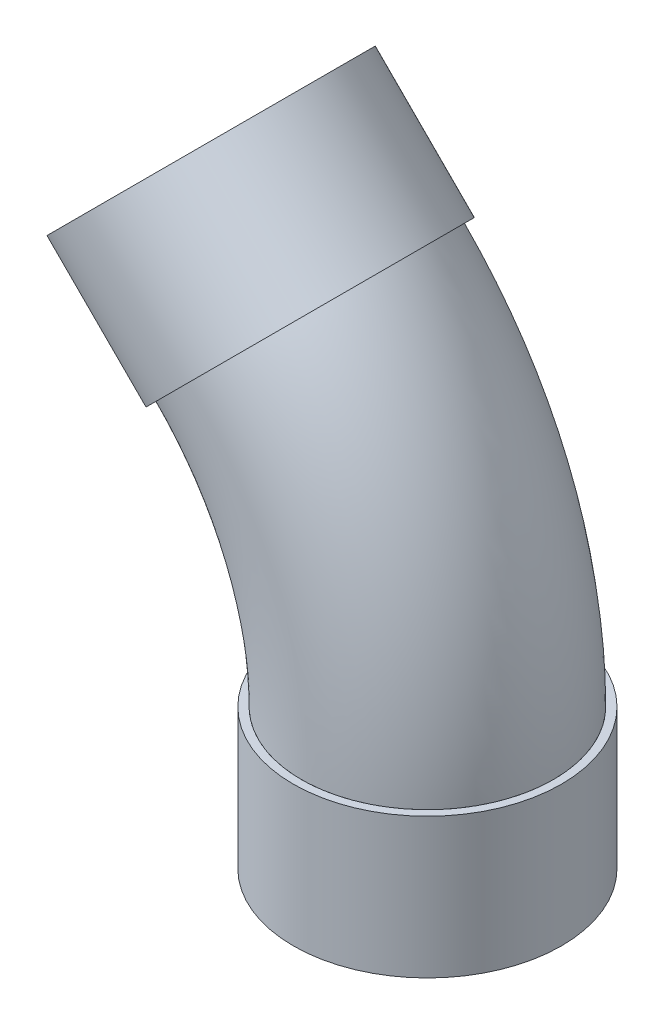
ISO-10303-21;
HEADER;
FILE_DESCRIPTION(('STEP AP214'),'2;1');
FILE_NAME('part.step','',(''),(''),'','','');
FILE_SCHEMA(('AUTOMOTIVE_DESIGN { 1 0 10303 214 1 1 1 1 }'));
ENDSEC;
DATA;
#1=APPLICATION_CONTEXT('core data for automotive mechanical design processes');
#2=APPLICATION_PROTOCOL_DEFINITION('international standard','automotive_design',2000,#1);
#3=PRODUCT_CONTEXT('',#1,'mechanical');
#4=PRODUCT('Part','Part','',(#3));
#5=PRODUCT_RELATED_PRODUCT_CATEGORY('part','',(#4));
#6=PRODUCT_DEFINITION_FORMATION('','',#4);
#7=PRODUCT_DEFINITION_CONTEXT('part definition',#1,'design');
#8=PRODUCT_DEFINITION('design','',#6,#7);
#9=PRODUCT_DEFINITION_SHAPE('','',#8);
#10=(LENGTH_UNIT() NAMED_UNIT(*) SI_UNIT(.MILLI.,.METRE.));
#11=(NAMED_UNIT(*) PLANE_ANGLE_UNIT() SI_UNIT($,.RADIAN.));
#12=(NAMED_UNIT(*) SI_UNIT($,.STERADIAN.) SOLID_ANGLE_UNIT());
#13=UNCERTAINTY_MEASURE_WITH_UNIT(LENGTH_MEASURE(1.E-05),#10,'distance_accuracy_value','');
#14=(GEOMETRIC_REPRESENTATION_CONTEXT(3) GLOBAL_UNCERTAINTY_ASSIGNED_CONTEXT((#13)) GLOBAL_UNIT_ASSIGNED_CONTEXT((#10,
#11,#12)) REPRESENTATION_CONTEXT('',''));
#15=CARTESIAN_POINT('',(0.,0.,0.));
#16=DIRECTION('',(0.,0.,1.));
#17=DIRECTION('',(1.,0.,0.));
#18=AXIS2_PLACEMENT_3D('',#15,#16,#17);
#19=CARTESIAN_POINT('',(-1.70639071493638E-10,1.70639071494461E-10,0.));
#20=DIRECTION('',(-0.707106781184842,0.707106781188253,0.));
#21=DIRECTION('',(-0.707106781188253,-0.707106781184842,0.));
#22=AXIS2_PLACEMENT_3D('',#19,#20,#21);
#23=PLANE('',#22);
#24=CARTESIAN_POINT('',(70.7106781186546,70.7106781186549,0.));
#25=DIRECTION('',(-0.707106781186548,0.707106781186547,0.));
#26=DIRECTION('',(-0.707106781186547,-0.707106781186548,0.));
#27=AXIS2_PLACEMENT_3D('',#24,#25,#26);
#28=CIRCLE('',#27,31.5);
#29=CARTESIAN_POINT('',(48.4368145112784,48.4368145112786,0.));
#30=VERTEX_POINT('',#29);
#31=EDGE_CURVE('E56',#30,#30,#28,.T.);
#32=ORIENTED_EDGE('',*,*,#31,.T.);
#33=EDGE_LOOP('',(#32));
#34=FACE_BOUND('',#33,.T.);
#35=CARTESIAN_POINT('',(70.7106781186546,70.7106781186549,0.));
#36=DIRECTION('',(-0.707106781186549,0.707106781186546,0.));
#37=DIRECTION('',(-0.707106781186546,-0.707106781186549,0.));
#38=AXIS2_PLACEMENT_3D('',#35,#36,#37);
#39=CIRCLE('',#38,33.5);
#40=CARTESIAN_POINT('',(47.0226009489053,47.0226009489055,0.));
#41=VERTEX_POINT('',#40);
#42=EDGE_CURVE('E48',#41,#41,#39,.T.);
#43=ORIENTED_EDGE('',*,*,#42,.F.);
#44=EDGE_LOOP('',(#43));
#45=FACE_BOUND('',#44,.T.);
#46=ADVANCED_FACE('F42',(#34,#45),#23,.F.);
#47=CARTESIAN_POINT('',(-24.7487373416998,24.7487373416998,0.));
#48=DIRECTION('',(-0.707106781184842,0.707106781188253,0.));
#49=DIRECTION('',(-0.707106781188253,-0.707106781184842,0.));
#50=AXIS2_PLACEMENT_3D('',#47,#48,#49);
#51=PLANE('',#50);
#52=CARTESIAN_POINT('',(45.9619407771254,95.459415460184,0.));
#53=DIRECTION('',(-0.707106781186548,0.707106781186547,0.));
#54=DIRECTION('',(-0.707106781186547,-0.707106781186548,0.));
#55=AXIS2_PLACEMENT_3D('',#52,#53,#54);
#56=CIRCLE('',#55,31.5);
#57=CARTESIAN_POINT('',(23.6880771697492,73.1855518528077,0.));
#58=VERTEX_POINT('',#57);
#59=EDGE_CURVE('E52',#58,#58,#56,.T.);
#60=ORIENTED_EDGE('',*,*,#59,.F.);
#61=EDGE_LOOP('',(#60));
#62=FACE_BOUND('',#61,.T.);
#63=CARTESIAN_POINT('',(45.9619407771254,95.459415460184,0.));
#64=DIRECTION('',(-0.707106781186549,0.707106781186546,0.));
#65=DIRECTION('',(-0.707106781186546,-0.707106781186549,0.));
#66=AXIS2_PLACEMENT_3D('',#63,#64,#65);
#67=CIRCLE('',#66,33.5);
#68=CARTESIAN_POINT('',(22.2738636073761,71.7713382904346,0.));
#69=VERTEX_POINT('',#68);
#70=EDGE_CURVE('E12',#69,#69,#67,.T.);
#71=ORIENTED_EDGE('',*,*,#70,.T.);
#72=EDGE_LOOP('',(#71));
#73=FACE_BOUND('',#72,.T.);
#74=ADVANCED_FACE('F71',(#62,#73),#51,.T.);
#75=CARTESIAN_POINT('',(70.7106781186546,70.7106781186549,0.));
#76=DIRECTION('',(-0.707106781186549,0.707106781186546,0.));
#77=DIRECTION('',(-0.707106781186546,-0.707106781186549,0.));
#78=AXIS2_PLACEMENT_3D('',#75,#76,#77);
#79=CYLINDRICAL_SURFACE('',#78,33.5);
#80=ORIENTED_EDGE('',*,*,#42,.T.);
#81=EDGE_LOOP('',(#80));
#82=FACE_BOUND('',#81,.T.);
#83=ORIENTED_EDGE('',*,*,#70,.F.);
#84=EDGE_LOOP('',(#83));
#85=FACE_BOUND('',#84,.T.);
#86=ADVANCED_FACE('F67',(#82,#85),#79,.T.);
#87=CARTESIAN_POINT('',(70.7106781186546,70.7106781186549,0.));
#88=DIRECTION('',(-0.707106781186549,0.707106781186546,0.));
#89=DIRECTION('',(-0.707106781186546,-0.707106781186549,0.));
#90=AXIS2_PLACEMENT_3D('',#87,#88,#89);
#91=CYLINDRICAL_SURFACE('',#90,31.5);
#92=ORIENTED_EDGE('',*,*,#31,.F.);
#93=EDGE_LOOP('',(#92));
#94=FACE_BOUND('',#93,.T.);
#95=ORIENTED_EDGE('',*,*,#59,.T.);
#96=EDGE_LOOP('',(#95));
#97=FACE_BOUND('',#96,.T.);
#98=ADVANCED_FACE('F64',(#94,#97),#91,.F.);
#99=CLOSED_SHELL('',(#46,#74,#86,#98));
#100=MANIFOLD_SOLID_BREP('B2',#99);
#101=CARTESIAN_POINT('',(100.,-35.,0.));
#102=DIRECTION('',(0.,1.,0.));
#103=DIRECTION('',(0.,0.,1.));
#104=AXIS2_PLACEMENT_3D('',#101,#102,#103);
#105=CYLINDRICAL_SURFACE('',#104,33.5);
#106=CARTESIAN_POINT('',(100.,-35.,0.));
#107=DIRECTION('',(0.,1.,0.));
#108=DIRECTION('',(0.,0.,1.));
#109=AXIS2_PLACEMENT_3D('',#106,#107,#108);
#110=CIRCLE('',#109,33.5);
#111=CARTESIAN_POINT('',(100.,-35.,33.5));
#112=VERTEX_POINT('',#111);
#113=EDGE_CURVE('E41',#112,#112,#110,.T.);
#114=ORIENTED_EDGE('',*,*,#113,.T.);
#115=EDGE_LOOP('',(#114));
#116=FACE_BOUND('',#115,.T.);
#117=CARTESIAN_POINT('',(100.,0.,0.));
#118=DIRECTION('',(0.,1.,0.));
#119=DIRECTION('',(0.,0.,1.));
#120=AXIS2_PLACEMENT_3D('',#117,#118,#119);
#121=CIRCLE('',#120,33.5);
#122=CARTESIAN_POINT('',(100.,0.,33.5));
#123=VERTEX_POINT('',#122);
#124=EDGE_CURVE('E114',#123,#123,#121,.T.);
#125=ORIENTED_EDGE('',*,*,#124,.F.);
#126=EDGE_LOOP('',(#125));
#127=FACE_BOUND('',#126,.T.);
#128=ADVANCED_FACE('F111',(#116,#127),#105,.T.);
#129=CARTESIAN_POINT('',(100.,-35.,0.));
#130=DIRECTION('',(0.,1.,0.));
#131=DIRECTION('',(0.,0.,1.));
#132=AXIS2_PLACEMENT_3D('',#129,#130,#131);
#133=PLANE('',#132);
#134=CARTESIAN_POINT('',(100.,-35.,0.));
#135=DIRECTION('',(0.,1.,0.));
#136=DIRECTION('',(0.,0.,1.));
#137=AXIS2_PLACEMENT_3D('',#134,#135,#136);
#138=CIRCLE('',#137,31.5);
#139=CARTESIAN_POINT('',(100.,-35.,31.5));
#140=VERTEX_POINT('',#139);
#141=EDGE_CURVE('E121',#140,#140,#138,.T.);
#142=ORIENTED_EDGE('',*,*,#141,.T.);
#143=EDGE_LOOP('',(#142));
#144=FACE_BOUND('',#143,.T.);
#145=ORIENTED_EDGE('',*,*,#113,.F.);
#146=EDGE_LOOP('',(#145));
#147=FACE_BOUND('',#146,.T.);
#148=ADVANCED_FACE('F129',(#144,#147),#133,.F.);
#149=CARTESIAN_POINT('',(100.,0.,0.));
#150=DIRECTION('',(0.,1.,0.));
#151=DIRECTION('',(0.,0.,1.));
#152=AXIS2_PLACEMENT_3D('',#149,#150,#151);
#153=PLANE('',#152);
#154=CARTESIAN_POINT('',(100.,0.,0.));
#155=DIRECTION('',(0.,1.,0.));
#156=DIRECTION('',(0.,0.,1.));
#157=AXIS2_PLACEMENT_3D('',#154,#155,#156);
#158=CIRCLE('',#157,31.5);
#159=CARTESIAN_POINT('',(100.,0.,31.5));
#160=VERTEX_POINT('',#159);
#161=EDGE_CURVE('E123',#160,#160,#158,.T.);
#162=ORIENTED_EDGE('',*,*,#161,.F.);
#163=EDGE_LOOP('',(#162));
#164=FACE_BOUND('',#163,.T.);
#165=ORIENTED_EDGE('',*,*,#124,.T.);
#166=EDGE_LOOP('',(#165));
#167=FACE_BOUND('',#166,.T.);
#168=ADVANCED_FACE('F135',(#164,#167),#153,.T.);
#169=CARTESIAN_POINT('',(100.,-35.,0.));
#170=DIRECTION('',(0.,1.,0.));
#171=DIRECTION('',(0.,0.,1.));
#172=AXIS2_PLACEMENT_3D('',#169,#170,#171);
#173=CYLINDRICAL_SURFACE('',#172,31.5);
#174=ORIENTED_EDGE('',*,*,#141,.F.);
#175=EDGE_LOOP('',(#174));
#176=FACE_BOUND('',#175,.T.);
#177=ORIENTED_EDGE('',*,*,#161,.T.);
#178=EDGE_LOOP('',(#177));
#179=FACE_BOUND('',#178,.T.);
#180=ADVANCED_FACE('F132',(#176,#179),#173,.F.);
#181=CLOSED_SHELL('',(#128,#148,#168,#180));
#182=MANIFOLD_SOLID_BREP('B7',#181);
#183=CARTESIAN_POINT('',(0.,0.,0.));
#184=DIRECTION('',(0.,0.,-1.));
#185=DIRECTION('',(-1.,0.,0.));
#186=AXIS2_PLACEMENT_3D('',#183,#184,#185);
#187=TOROIDAL_SURFACE('',#186,100.,29.5);
#188=CARTESIAN_POINT('',(70.7106781186546,70.7106781186549,0.));
#189=DIRECTION('',(-0.707106781186549,0.707106781186546,0.));
#190=DIRECTION('',(0.,0.,1.));
#191=AXIS2_PLACEMENT_3D('',#188,#189,#190);
#192=CIRCLE('',#191,29.5);
#193=CARTESIAN_POINT('',(91.5703281636578,91.5703281636581,0.));
#194=VERTEX_POINT('',#193);
#195=EDGE_CURVE('E180',#194,#194,#192,.T.);
#196=CARTESIAN_POINT('',(100.,0.,0.));
#197=DIRECTION('',(0.,1.,0.));
#198=DIRECTION('',(0.,0.,1.));
#199=AXIS2_PLACEMENT_3D('',#196,#197,#198);
#200=CIRCLE('',#199,29.5);
#201=CARTESIAN_POINT('',(129.5,0.,0.));
#202=VERTEX_POINT('',#201);
#203=EDGE_CURVE('E188',#202,#202,#200,.T.);
#204=CARTESIAN_POINT('',(0.,0.,0.));
#205=DIRECTION('',(0.,0.,-1.));
#206=DIRECTION('',(-1.,0.,0.));
#207=AXIS2_PLACEMENT_3D('',#204,#205,#206);
#208=CIRCLE('',#207,129.5);
#209=EDGE_CURVE('',#194,#202,#208,.T.);
#210=ORIENTED_EDGE('',*,*,#195,.T.);
#211=ORIENTED_EDGE('',*,*,#203,.F.);
#212=ORIENTED_EDGE('',*,*,#209,.T.);
#213=ORIENTED_EDGE('',*,*,#209,.F.);
#214=EDGE_LOOP('',(#210,#212,#211,#213));
#215=FACE_BOUND('',#214,.T.);
#216=ADVANCED_FACE('F173',(#215),#187,.F.);
#217=CARTESIAN_POINT('',(0.,0.,0.));
#218=DIRECTION('',(0.,0.,-1.));
#219=DIRECTION('',(-1.,0.,0.));
#220=AXIS2_PLACEMENT_3D('',#217,#218,#219);
#221=TOROIDAL_SURFACE('',#220,100.,31.5);
#222=CARTESIAN_POINT('',(70.7106781186546,70.7106781186549,0.));
#223=DIRECTION('',(-0.707106781186549,0.707106781186546,0.));
#224=DIRECTION('',(0.,0.,1.));
#225=AXIS2_PLACEMENT_3D('',#222,#223,#224);
#226=CIRCLE('',#225,31.5);
#227=CARTESIAN_POINT('',(92.9845417260309,92.9845417260312,0.));
#228=VERTEX_POINT('',#227);
#229=EDGE_CURVE('E110',#228,#228,#226,.T.);
#230=CARTESIAN_POINT('',(100.,0.,0.));
#231=DIRECTION('',(0.,1.,0.));
#232=DIRECTION('',(0.,0.,1.));
#233=AXIS2_PLACEMENT_3D('',#230,#231,#232);
#234=CIRCLE('',#233,31.5);
#235=CARTESIAN_POINT('',(131.5,0.,0.));
#236=VERTEX_POINT('',#235);
#237=EDGE_CURVE('E184',#236,#236,#234,.T.);
#238=CARTESIAN_POINT('',(0.,0.,0.));
#239=DIRECTION('',(0.,0.,-1.));
#240=DIRECTION('',(-1.,0.,0.));
#241=AXIS2_PLACEMENT_3D('',#238,#239,#240);
#242=CIRCLE('',#241,131.5);
#243=EDGE_CURVE('',#228,#236,#242,.T.);
#244=ORIENTED_EDGE('',*,*,#229,.F.);
#245=ORIENTED_EDGE('',*,*,#237,.T.);
#246=ORIENTED_EDGE('',*,*,#243,.T.);
#247=ORIENTED_EDGE('',*,*,#243,.F.);
#248=EDGE_LOOP('',(#244,#246,#245,#247));
#249=FACE_BOUND('',#248,.T.);
#250=ADVANCED_FACE('F175',(#249),#221,.T.);
#251=CARTESIAN_POINT('',(70.7106781186546,70.7106781186549,0.));
#252=DIRECTION('',(-0.707106781186549,0.707106781186546,0.));
#253=DIRECTION('',(0.,0.,1.));
#254=AXIS2_PLACEMENT_3D('',#251,#252,#253);
#255=PLANE('',#254);
#256=ORIENTED_EDGE('',*,*,#195,.F.);
#257=EDGE_LOOP('',(#256));
#258=FACE_BOUND('',#257,.T.);
#259=ORIENTED_EDGE('',*,*,#229,.T.);
#260=EDGE_LOOP('',(#259));
#261=FACE_BOUND('',#260,.T.);
#262=ADVANCED_FACE('F201',(#258,#261),#255,.T.);
#263=CARTESIAN_POINT('',(100.,0.,0.));
#264=DIRECTION('',(0.,1.,0.));
#265=DIRECTION('',(0.,0.,1.));
#266=AXIS2_PLACEMENT_3D('',#263,#264,#265);
#267=PLANE('',#266);
#268=ORIENTED_EDGE('',*,*,#203,.T.);
#269=EDGE_LOOP('',(#268));
#270=FACE_BOUND('',#269,.T.);
#271=ORIENTED_EDGE('',*,*,#237,.F.);
#272=EDGE_LOOP('',(#271));
#273=FACE_BOUND('',#272,.T.);
#274=ADVANCED_FACE('F194',(#270,#273),#267,.F.);
#275=CLOSED_SHELL('',(#216,#250,#262,#274));
#276=MANIFOLD_SOLID_BREP('B36',#275);
#277=ADVANCED_BREP_SHAPE_REPRESENTATION('',(#18,#100,#182,#276),#14);
#278=SHAPE_DEFINITION_REPRESENTATION(#9,#277);
ENDSEC;
END-ISO-10303-21;
